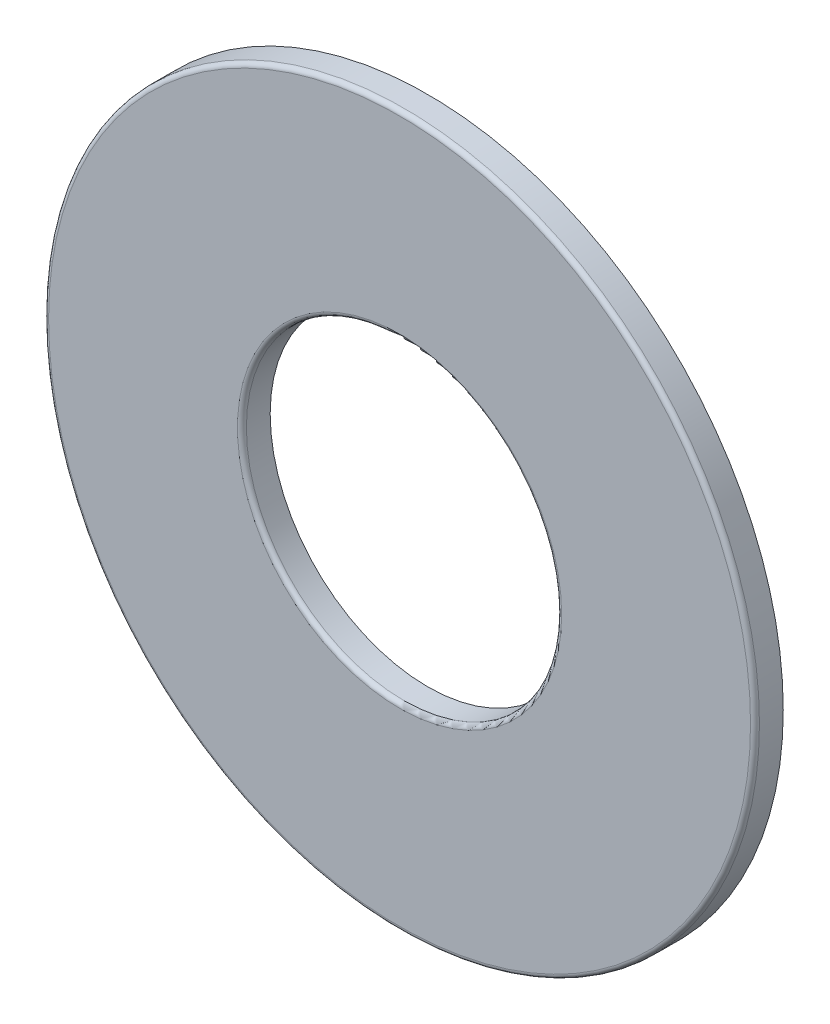
ISO-10303-21;
HEADER;
FILE_DESCRIPTION(('STEP AP214'),'2;1');
FILE_NAME('part.step','',(''),(''),'','','');
FILE_SCHEMA(('AUTOMOTIVE_DESIGN { 1 0 10303 214 1 1 1 1 }'));
ENDSEC;
DATA;
#1=APPLICATION_CONTEXT('core data for automotive mechanical design processes');
#2=APPLICATION_PROTOCOL_DEFINITION('international standard','automotive_design',2000,#1);
#3=PRODUCT_CONTEXT('',#1,'mechanical');
#4=PRODUCT('Part','Part','',(#3));
#5=PRODUCT_RELATED_PRODUCT_CATEGORY('part','',(#4));
#6=PRODUCT_DEFINITION_FORMATION('','',#4);
#7=PRODUCT_DEFINITION_CONTEXT('part definition',#1,'design');
#8=PRODUCT_DEFINITION('design','',#6,#7);
#9=PRODUCT_DEFINITION_SHAPE('','',#8);
#10=(LENGTH_UNIT() NAMED_UNIT(*) SI_UNIT(.MILLI.,.METRE.));
#11=(NAMED_UNIT(*) PLANE_ANGLE_UNIT() SI_UNIT($,.RADIAN.));
#12=(NAMED_UNIT(*) SI_UNIT($,.STERADIAN.) SOLID_ANGLE_UNIT());
#13=UNCERTAINTY_MEASURE_WITH_UNIT(LENGTH_MEASURE(1.E-05),#10,'distance_accuracy_value','');
#14=(GEOMETRIC_REPRESENTATION_CONTEXT(3) GLOBAL_UNCERTAINTY_ASSIGNED_CONTEXT((#13)) GLOBAL_UNIT_ASSIGNED_CONTEXT((#10,
#11,#12)) REPRESENTATION_CONTEXT('',''));
#15=CARTESIAN_POINT('',(0.,0.,0.));
#16=DIRECTION('',(0.,0.,1.));
#17=DIRECTION('',(1.,0.,0.));
#18=AXIS2_PLACEMENT_3D('',#15,#16,#17);
#19=CARTESIAN_POINT('',(0.,0.,-0.8));
#20=DIRECTION('',(0.,0.,1.));
#21=DIRECTION('',(1.,0.,0.));
#22=AXIS2_PLACEMENT_3D('',#19,#20,#21);
#23=TOROIDAL_SURFACE('',#22,47.2,0.300000000000001);
#24=CARTESIAN_POINT('',(0.,0.,-0.800000000000002));
#25=DIRECTION('',(0.,0.,1.));
#26=DIRECTION('',(1.,0.,0.));
#27=AXIS2_PLACEMENT_3D('',#24,#25,#26);
#28=CIRCLE('',#27,47.5);
#29=CARTESIAN_POINT('',(47.5,0.,-0.800000000000002));
#30=VERTEX_POINT('',#29);
#31=EDGE_CURVE('E38',#30,#30,#28,.T.);
#32=ORIENTED_EDGE('',*,*,#31,.F.);
#33=EDGE_LOOP('',(#32));
#34=FACE_BOUND('',#33,.T.);
#35=CARTESIAN_POINT('',(0.,0.,-0.5));
#36=DIRECTION('',(0.,0.,1.));
#37=DIRECTION('',(1.,0.,0.));
#38=AXIS2_PLACEMENT_3D('',#35,#36,#37);
#39=CIRCLE('',#38,47.2);
#40=CARTESIAN_POINT('',(47.2,0.,-0.5));
#41=VERTEX_POINT('',#40);
#42=EDGE_CURVE('E10',#41,#41,#39,.T.);
#43=ORIENTED_EDGE('',*,*,#42,.T.);
#44=EDGE_LOOP('',(#43));
#45=FACE_BOUND('',#44,.T.);
#46=ADVANCED_FACE('F32',(#34,#45),#23,.F.);
#47=CARTESIAN_POINT('',(0.,0.,0.));
#48=DIRECTION('',(0.,0.,1.));
#49=DIRECTION('',(1.,0.,0.));
#50=AXIS2_PLACEMENT_3D('',#47,#48,#49);
#51=CYLINDRICAL_SURFACE('',#50,47.5);
#52=CARTESIAN_POINT('',(0.,0.,-4.));
#53=DIRECTION('',(0.,0.,1.));
#54=DIRECTION('',(1.,0.,0.));
#55=AXIS2_PLACEMENT_3D('',#52,#53,#54);
#56=CIRCLE('',#55,47.5);
#57=CARTESIAN_POINT('',(47.5,0.,-4.));
#58=VERTEX_POINT('',#57);
#59=EDGE_CURVE('E42',#58,#58,#56,.T.);
#60=ORIENTED_EDGE('',*,*,#59,.F.);
#61=EDGE_LOOP('',(#60));
#62=FACE_BOUND('',#61,.T.);
#63=ORIENTED_EDGE('',*,*,#31,.T.);
#64=EDGE_LOOP('',(#63));
#65=FACE_BOUND('',#64,.T.);
#66=ADVANCED_FACE('F129',(#62,#65),#51,.F.);
#67=CARTESIAN_POINT('',(-47.5,0.,-4.));
#68=DIRECTION('',(0.,0.,1.));
#69=DIRECTION('',(1.,0.,0.));
#70=AXIS2_PLACEMENT_3D('',#67,#68,#69);
#71=PLANE('',#70);
#72=CARTESIAN_POINT('',(0.,0.,-4.));
#73=DIRECTION('',(0.,0.,1.));
#74=DIRECTION('',(1.,0.,0.));
#75=AXIS2_PLACEMENT_3D('',#72,#73,#74);
#76=CIRCLE('',#75,47.8);
#77=CARTESIAN_POINT('',(47.8,0.,-4.));
#78=VERTEX_POINT('',#77);
#79=EDGE_CURVE('E46',#78,#78,#76,.T.);
#80=ORIENTED_EDGE('',*,*,#79,.F.);
#81=EDGE_LOOP('',(#80));
#82=FACE_BOUND('',#81,.T.);
#83=ORIENTED_EDGE('',*,*,#59,.T.);
#84=EDGE_LOOP('',(#83));
#85=FACE_BOUND('',#84,.T.);
#86=ADVANCED_FACE('F123',(#82,#85),#71,.F.);
#87=CARTESIAN_POINT('',(0.,0.,0.));
#88=DIRECTION('',(0.,0.,1.));
#89=DIRECTION('',(1.,0.,0.));
#90=AXIS2_PLACEMENT_3D('',#87,#88,#89);
#91=CYLINDRICAL_SURFACE('',#90,47.8);
#92=CARTESIAN_POINT('',(0.,0.,-0.800000000000004));
#93=DIRECTION('',(0.,0.,1.));
#94=DIRECTION('',(1.,0.,0.));
#95=AXIS2_PLACEMENT_3D('',#92,#93,#94);
#96=CIRCLE('',#95,47.8);
#97=CARTESIAN_POINT('',(47.8,0.,-0.800000000000004));
#98=VERTEX_POINT('',#97);
#99=EDGE_CURVE('E51',#98,#98,#96,.T.);
#100=ORIENTED_EDGE('',*,*,#99,.F.);
#101=EDGE_LOOP('',(#100));
#102=FACE_BOUND('',#101,.T.);
#103=ORIENTED_EDGE('',*,*,#79,.T.);
#104=EDGE_LOOP('',(#103));
#105=FACE_BOUND('',#104,.T.);
#106=ADVANCED_FACE('F117',(#102,#105),#91,.T.);
#107=CARTESIAN_POINT('',(0.,0.,-0.8));
#108=DIRECTION('',(0.,0.,1.));
#109=DIRECTION('',(1.,0.,0.));
#110=AXIS2_PLACEMENT_3D('',#107,#108,#109);
#111=TOROIDAL_SURFACE('',#110,47.2,0.600000000000002);
#112=CARTESIAN_POINT('',(0.,0.,-0.199999999999998));
#113=DIRECTION('',(0.,0.,1.));
#114=DIRECTION('',(1.,0.,0.));
#115=AXIS2_PLACEMENT_3D('',#112,#113,#114);
#116=CIRCLE('',#115,47.2);
#117=CARTESIAN_POINT('',(47.2,0.,-0.199999999999998));
#118=VERTEX_POINT('',#117);
#119=EDGE_CURVE('E54',#118,#118,#116,.T.);
#120=ORIENTED_EDGE('',*,*,#119,.F.);
#121=EDGE_LOOP('',(#120));
#122=FACE_BOUND('',#121,.T.);
#123=ORIENTED_EDGE('',*,*,#99,.T.);
#124=EDGE_LOOP('',(#123));
#125=FACE_BOUND('',#124,.T.);
#126=ADVANCED_FACE('F111',(#122,#125),#111,.T.);
#127=CARTESIAN_POINT('',(-47.2,0.,-0.199999999999999));
#128=DIRECTION('',(0.,0.,-1.));
#129=DIRECTION('',(-1.,0.,0.));
#130=AXIS2_PLACEMENT_3D('',#127,#128,#129);
#131=PLANE('',#130);
#132=CARTESIAN_POINT('',(0.,0.,-0.2));
#133=DIRECTION('',(0.,0.,1.));
#134=DIRECTION('',(1.,0.,0.));
#135=AXIS2_PLACEMENT_3D('',#132,#133,#134);
#136=CIRCLE('',#135,21.8);
#137=CARTESIAN_POINT('',(21.8,0.,-0.2));
#138=VERTEX_POINT('',#137);
#139=EDGE_CURVE('E57',#138,#138,#136,.T.);
#140=ORIENTED_EDGE('',*,*,#139,.F.);
#141=EDGE_LOOP('',(#140));
#142=FACE_BOUND('',#141,.T.);
#143=ORIENTED_EDGE('',*,*,#119,.T.);
#144=EDGE_LOOP('',(#143));
#145=FACE_BOUND('',#144,.T.);
#146=ADVANCED_FACE('F105',(#142,#145),#131,.F.);
#147=CARTESIAN_POINT('',(0.,0.,-0.8));
#148=DIRECTION('',(0.,0.,1.));
#149=DIRECTION('',(1.,0.,0.));
#150=AXIS2_PLACEMENT_3D('',#147,#148,#149);
#151=TOROIDAL_SURFACE('',#150,21.8,0.6);
#152=CARTESIAN_POINT('',(0.,0.,-0.800000000000004));
#153=DIRECTION('',(0.,0.,1.));
#154=DIRECTION('',(1.,0.,0.));
#155=AXIS2_PLACEMENT_3D('',#152,#153,#154);
#156=CIRCLE('',#155,21.2);
#157=CARTESIAN_POINT('',(21.2,0.,-0.800000000000004));
#158=VERTEX_POINT('',#157);
#159=EDGE_CURVE('E60',#158,#158,#156,.T.);
#160=ORIENTED_EDGE('',*,*,#159,.F.);
#161=EDGE_LOOP('',(#160));
#162=FACE_BOUND('',#161,.T.);
#163=ORIENTED_EDGE('',*,*,#139,.T.);
#164=EDGE_LOOP('',(#163));
#165=FACE_BOUND('',#164,.T.);
#166=ADVANCED_FACE('F99',(#162,#165),#151,.T.);
#167=CARTESIAN_POINT('',(0.,0.,0.));
#168=DIRECTION('',(0.,0.,1.));
#169=DIRECTION('',(1.,0.,0.));
#170=AXIS2_PLACEMENT_3D('',#167,#168,#169);
#171=CYLINDRICAL_SURFACE('',#170,21.2);
#172=CARTESIAN_POINT('',(0.,0.,-4.));
#173=DIRECTION('',(0.,0.,1.));
#174=DIRECTION('',(1.,0.,0.));
#175=AXIS2_PLACEMENT_3D('',#172,#173,#174);
#176=CIRCLE('',#175,21.2);
#177=CARTESIAN_POINT('',(21.2,0.,-4.));
#178=VERTEX_POINT('',#177);
#179=EDGE_CURVE('E63',#178,#178,#176,.T.);
#180=ORIENTED_EDGE('',*,*,#179,.F.);
#181=EDGE_LOOP('',(#180));
#182=FACE_BOUND('',#181,.T.);
#183=ORIENTED_EDGE('',*,*,#159,.T.);
#184=EDGE_LOOP('',(#183));
#185=FACE_BOUND('',#184,.T.);
#186=ADVANCED_FACE('F93',(#182,#185),#171,.F.);
#187=CARTESIAN_POINT('',(-21.2,0.,-4.));
#188=DIRECTION('',(0.,0.,1.));
#189=DIRECTION('',(1.,0.,0.));
#190=AXIS2_PLACEMENT_3D('',#187,#188,#189);
#191=PLANE('',#190);
#192=CARTESIAN_POINT('',(0.,0.,-4.));
#193=DIRECTION('',(0.,0.,1.));
#194=DIRECTION('',(1.,0.,0.));
#195=AXIS2_PLACEMENT_3D('',#192,#193,#194);
#196=CIRCLE('',#195,21.5);
#197=CARTESIAN_POINT('',(21.5,0.,-4.));
#198=VERTEX_POINT('',#197);
#199=EDGE_CURVE('E66',#198,#198,#196,.T.);
#200=ORIENTED_EDGE('',*,*,#199,.F.);
#201=EDGE_LOOP('',(#200));
#202=FACE_BOUND('',#201,.T.);
#203=ORIENTED_EDGE('',*,*,#179,.T.);
#204=EDGE_LOOP('',(#203));
#205=FACE_BOUND('',#204,.T.);
#206=ADVANCED_FACE('F87',(#202,#205),#191,.F.);
#207=CARTESIAN_POINT('',(0.,0.,0.));
#208=DIRECTION('',(0.,0.,1.));
#209=DIRECTION('',(1.,0.,0.));
#210=AXIS2_PLACEMENT_3D('',#207,#208,#209);
#211=CYLINDRICAL_SURFACE('',#210,21.5);
#212=CARTESIAN_POINT('',(0.,0.,-0.800000000000002));
#213=DIRECTION('',(0.,0.,1.));
#214=DIRECTION('',(1.,0.,0.));
#215=AXIS2_PLACEMENT_3D('',#212,#213,#214);
#216=CIRCLE('',#215,21.5);
#217=CARTESIAN_POINT('',(21.5,0.,-0.800000000000002));
#218=VERTEX_POINT('',#217);
#219=EDGE_CURVE('E69',#218,#218,#216,.T.);
#220=ORIENTED_EDGE('',*,*,#219,.F.);
#221=EDGE_LOOP('',(#220));
#222=FACE_BOUND('',#221,.T.);
#223=ORIENTED_EDGE('',*,*,#199,.T.);
#224=EDGE_LOOP('',(#223));
#225=FACE_BOUND('',#224,.T.);
#226=ADVANCED_FACE('F81',(#222,#225),#211,.T.);
#227=CARTESIAN_POINT('',(0.,0.,-0.8));
#228=DIRECTION('',(0.,0.,1.));
#229=DIRECTION('',(1.,0.,0.));
#230=AXIS2_PLACEMENT_3D('',#227,#228,#229);
#231=TOROIDAL_SURFACE('',#230,21.8,0.300000000000001);
#232=CARTESIAN_POINT('',(0.,0.,-0.499999999999999));
#233=DIRECTION('',(0.,0.,1.));
#234=DIRECTION('',(1.,0.,0.));
#235=AXIS2_PLACEMENT_3D('',#232,#233,#234);
#236=CIRCLE('',#235,21.8);
#237=CARTESIAN_POINT('',(21.8,0.,-0.499999999999999));
#238=VERTEX_POINT('',#237);
#239=EDGE_CURVE('E72',#238,#238,#236,.T.);
#240=ORIENTED_EDGE('',*,*,#239,.F.);
#241=EDGE_LOOP('',(#240));
#242=FACE_BOUND('',#241,.T.);
#243=ORIENTED_EDGE('',*,*,#219,.T.);
#244=EDGE_LOOP('',(#243));
#245=FACE_BOUND('',#244,.T.);
#246=ADVANCED_FACE('F78',(#242,#245),#231,.F.);
#247=CARTESIAN_POINT('',(-22.5,0.,-0.5));
#248=DIRECTION('',(0.,0.,1.));
#249=DIRECTION('',(1.,0.,0.));
#250=AXIS2_PLACEMENT_3D('',#247,#248,#249);
#251=PLANE('',#250);
#252=ORIENTED_EDGE('',*,*,#42,.F.);
#253=EDGE_LOOP('',(#252));
#254=FACE_BOUND('',#253,.T.);
#255=ORIENTED_EDGE('',*,*,#239,.T.);
#256=EDGE_LOOP('',(#255));
#257=FACE_BOUND('',#256,.T.);
#258=ADVANCED_FACE('F76',(#254,#257),#251,.F.);
#259=CLOSED_SHELL('',(#46,#66,#86,#106,#126,#146,#166,#186,#206,#226,#246,#258));
#260=MANIFOLD_SOLID_BREP('B2',#259);
#261=ADVANCED_BREP_SHAPE_REPRESENTATION('',(#18,#260),#14);
#262=SHAPE_DEFINITION_REPRESENTATION(#9,#261);
ENDSEC;
END-ISO-10303-21;
